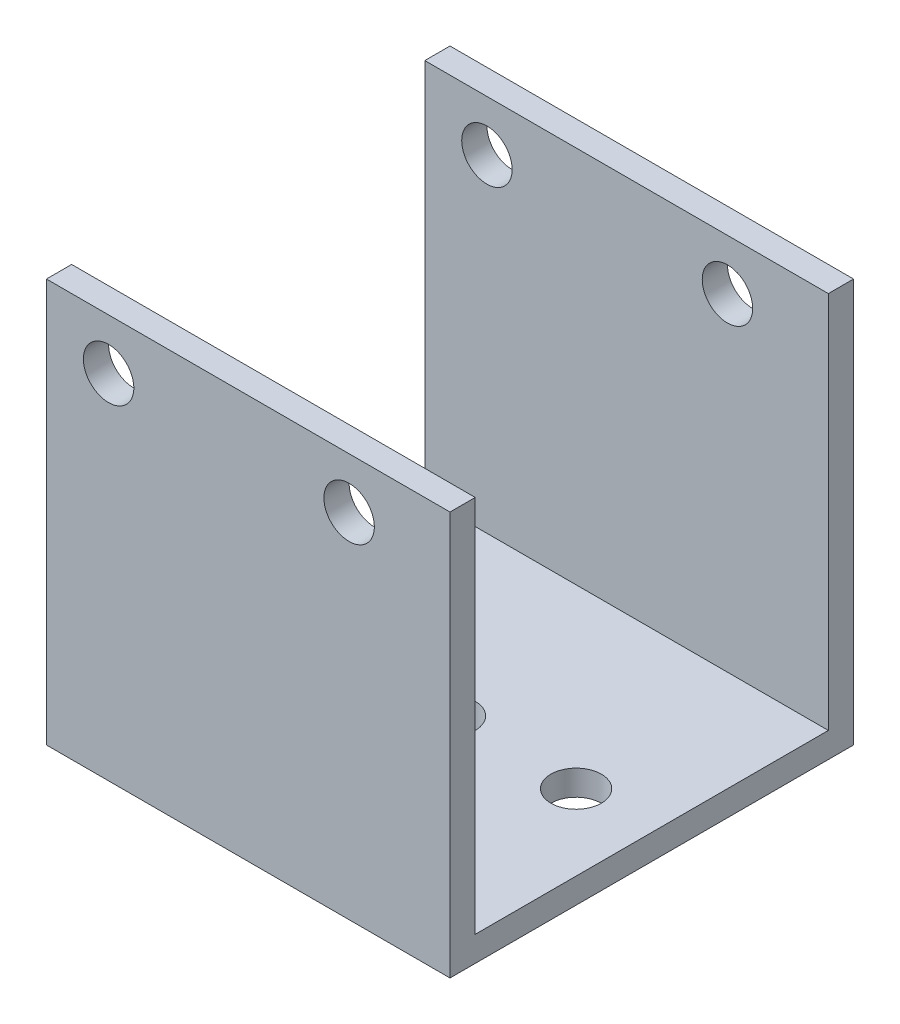
ISO-10303-21;
HEADER;
FILE_DESCRIPTION(('STEP AP214'),'2;1');
FILE_NAME('part.step','',(''),(''),'','','');
FILE_SCHEMA(('AUTOMOTIVE_DESIGN { 1 0 10303 214 1 1 1 1 }'));
ENDSEC;
DATA;
#1=APPLICATION_CONTEXT('core data for automotive mechanical design processes');
#2=APPLICATION_PROTOCOL_DEFINITION('international standard','automotive_design',2000,#1);
#3=PRODUCT_CONTEXT('',#1,'mechanical');
#4=PRODUCT('Part','Part','',(#3));
#5=PRODUCT_RELATED_PRODUCT_CATEGORY('part','',(#4));
#6=PRODUCT_DEFINITION_FORMATION('','',#4);
#7=PRODUCT_DEFINITION_CONTEXT('part definition',#1,'design');
#8=PRODUCT_DEFINITION('design','',#6,#7);
#9=PRODUCT_DEFINITION_SHAPE('','',#8);
#10=(LENGTH_UNIT() NAMED_UNIT(*) SI_UNIT(.MILLI.,.METRE.));
#11=(NAMED_UNIT(*) PLANE_ANGLE_UNIT() SI_UNIT($,.RADIAN.));
#12=(NAMED_UNIT(*) SI_UNIT($,.STERADIAN.) SOLID_ANGLE_UNIT());
#13=UNCERTAINTY_MEASURE_WITH_UNIT(LENGTH_MEASURE(1.E-05),#10,'distance_accuracy_value','');
#14=(GEOMETRIC_REPRESENTATION_CONTEXT(3) GLOBAL_UNCERTAINTY_ASSIGNED_CONTEXT((#13)) GLOBAL_UNIT_ASSIGNED_CONTEXT((#10,
#11,#12)) REPRESENTATION_CONTEXT('',''));
#15=CARTESIAN_POINT('',(0.,0.,0.));
#16=DIRECTION('',(0.,0.,1.));
#17=DIRECTION('',(1.,0.,0.));
#18=AXIS2_PLACEMENT_3D('',#15,#16,#17);
#19=CARTESIAN_POINT('',(50.8,19.0697917650766,29.2658872986316));
#20=DIRECTION('',(0.,-1.,0.));
#21=DIRECTION('',(0.,0.,-1.));
#22=AXIS2_PLACEMENT_3D('',#19,#20,#21);
#23=PLANE('',#22);
#24=DIRECTION('',(0.,0.,1.));
#25=VECTOR('',#24,1.);
#26=CARTESIAN_POINT('',(0.,19.0697917650766,29.2658872986316));
#27=LINE('',#26,#25);
#28=CARTESIAN_POINT('',(0.,19.0697917650766,26.0908872986316));
#29=VERTEX_POINT('',#28);
#30=CARTESIAN_POINT('',(0.,19.0697917650766,29.2658872986316));
#31=VERTEX_POINT('',#30);
#32=EDGE_CURVE('E131',#29,#31,#27,.T.);
#33=ORIENTED_EDGE('',*,*,#32,.T.);
#34=DIRECTION('',(-1.,0.,0.));
#35=VECTOR('',#34,1.);
#36=CARTESIAN_POINT('',(50.8,19.0697917650766,29.2658872986316));
#37=LINE('',#36,#35);
#38=CARTESIAN_POINT('',(50.8,19.0697917650766,29.2658872986316));
#39=VERTEX_POINT('',#38);
#40=EDGE_CURVE('E11',#39,#31,#37,.T.);
#41=ORIENTED_EDGE('',*,*,#40,.F.);
#42=DIRECTION('',(0.,0.,1.));
#43=VECTOR('',#42,1.);
#44=CARTESIAN_POINT('',(50.8,19.0697917650766,29.2658872986316));
#45=LINE('',#44,#43);
#46=CARTESIAN_POINT('',(50.8,19.0697917650766,26.0908872986316));
#47=VERTEX_POINT('',#46);
#48=EDGE_CURVE('E146',#47,#39,#45,.T.);
#49=ORIENTED_EDGE('',*,*,#48,.F.);
#50=DIRECTION('',(-1.,0.,0.));
#51=VECTOR('',#50,1.);
#52=CARTESIAN_POINT('',(50.8,19.0697917650766,26.0908872986316));
#53=LINE('',#52,#51);
#54=EDGE_CURVE('E127',#47,#29,#53,.T.);
#55=ORIENTED_EDGE('',*,*,#54,.T.);
#56=EDGE_LOOP('',(#33,#41,#49,#55));
#57=FACE_BOUND('',#56,.T.);
#58=ADVANCED_FACE('F33',(#57),#23,.F.);
#59=CARTESIAN_POINT('',(50.8,19.0697917650766,29.2658872986316));
#60=DIRECTION('',(0.,0.,-1.));
#61=DIRECTION('',(0.,1.,0.));
#62=AXIS2_PLACEMENT_3D('',#59,#60,#61);
#63=PLANE('',#62);
#64=CARTESIAN_POINT('',(7.82320000000001,12.6804917650766,29.2658872986315));
#65=DIRECTION('',(0.,0.,-1.));
#66=DIRECTION('',(-1.,0.,0.));
#67=AXIS2_PLACEMENT_3D('',#64,#65,#66);
#68=CIRCLE('',#67,3.175);
#69=CARTESIAN_POINT('',(4.64820000000001,12.6804917650766,29.2658872986315));
#70=VERTEX_POINT('',#69);
#71=EDGE_CURVE('E166',#70,#70,#68,.T.);
#72=ORIENTED_EDGE('',*,*,#71,.T.);
#73=EDGE_LOOP('',(#72));
#74=FACE_BOUND('',#73,.T.);
#75=CARTESIAN_POINT('',(38.1,12.6804917650766,29.2658872986315));
#76=DIRECTION('',(0.,0.,-1.));
#77=DIRECTION('',(-1.,0.,0.));
#78=AXIS2_PLACEMENT_3D('',#75,#76,#77);
#79=CIRCLE('',#78,3.175);
#80=CARTESIAN_POINT('',(34.925,12.6804917650766,29.2658872986315));
#81=VERTEX_POINT('',#80);
#82=EDGE_CURVE('E161',#81,#81,#79,.T.);
#83=ORIENTED_EDGE('',*,*,#82,.T.);
#84=EDGE_LOOP('',(#83));
#85=FACE_BOUND('',#84,.T.);
#86=DIRECTION('',(0.,-1.,0.));
#87=VECTOR('',#86,1.);
#88=CARTESIAN_POINT('',(0.,19.0697917650766,29.2658872986316));
#89=LINE('',#88,#87);
#90=CARTESIAN_POINT('',(0.,-31.7302082349234,29.2658872986315));
#91=VERTEX_POINT('',#90);
#92=EDGE_CURVE('E134',#31,#91,#89,.T.);
#93=ORIENTED_EDGE('',*,*,#92,.T.);
#94=DIRECTION('',(-1.,0.,0.));
#95=VECTOR('',#94,1.);
#96=CARTESIAN_POINT('',(50.8,-31.7302082349234,29.2658872986315));
#97=LINE('',#96,#95);
#98=CARTESIAN_POINT('',(50.8,-31.7302082349234,29.2658872986315));
#99=VERTEX_POINT('',#98);
#100=EDGE_CURVE('E42',#99,#91,#97,.T.);
#101=ORIENTED_EDGE('',*,*,#100,.F.);
#102=DIRECTION('',(0.,-1.,0.));
#103=VECTOR('',#102,1.);
#104=CARTESIAN_POINT('',(50.8,19.0697917650766,29.2658872986316));
#105=LINE('',#104,#103);
#106=EDGE_CURVE('E94',#39,#99,#105,.T.);
#107=ORIENTED_EDGE('',*,*,#106,.F.);
#108=ORIENTED_EDGE('',*,*,#40,.T.);
#109=EDGE_LOOP('',(#93,#101,#107,#108));
#110=FACE_BOUND('',#109,.T.);
#111=ADVANCED_FACE('F235',(#74,#85,#110),#63,.F.);
#112=CARTESIAN_POINT('',(50.8,-31.7302082349234,29.2658872986315));
#113=DIRECTION('',(0.,1.,0.));
#114=DIRECTION('',(0.,0.,1.));
#115=AXIS2_PLACEMENT_3D('',#112,#113,#114);
#116=PLANE('',#115);
#117=CARTESIAN_POINT('',(9.525,-31.7302082349234,3.86588729863155));
#118=DIRECTION('',(0.,-1.,0.));
#119=DIRECTION('',(0.,0.,-1.));
#120=AXIS2_PLACEMENT_3D('',#117,#118,#119);
#121=CIRCLE('',#120,3.175);
#122=CARTESIAN_POINT('',(9.525,-31.7302082349234,0.690887298631547));
#123=VERTEX_POINT('',#122);
#124=EDGE_CURVE('E183',#123,#123,#121,.T.);
#125=ORIENTED_EDGE('',*,*,#124,.F.);
#126=EDGE_LOOP('',(#125));
#127=FACE_BOUND('',#126,.T.);
#128=CARTESIAN_POINT('',(25.4,-31.7302082349234,3.86588729863155));
#129=DIRECTION('',(0.,-1.,0.));
#130=DIRECTION('',(0.,0.,-1.));
#131=AXIS2_PLACEMENT_3D('',#128,#129,#130);
#132=CIRCLE('',#131,3.175);
#133=CARTESIAN_POINT('',(25.4,-31.7302082349234,0.690887298631547));
#134=VERTEX_POINT('',#133);
#135=EDGE_CURVE('E173',#134,#134,#132,.T.);
#136=ORIENTED_EDGE('',*,*,#135,.F.);
#137=EDGE_LOOP('',(#136));
#138=FACE_BOUND('',#137,.T.);
#139=CARTESIAN_POINT('',(41.275,-31.7302082349234,3.86588729863155));
#140=DIRECTION('',(0.,-1.,0.));
#141=DIRECTION('',(0.,0.,-1.));
#142=AXIS2_PLACEMENT_3D('',#139,#140,#141);
#143=CIRCLE('',#142,3.175);
#144=CARTESIAN_POINT('',(41.275,-31.7302082349234,0.690887298631551));
#145=VERTEX_POINT('',#144);
#146=EDGE_CURVE('E170',#145,#145,#143,.T.);
#147=ORIENTED_EDGE('',*,*,#146,.F.);
#148=EDGE_LOOP('',(#147));
#149=FACE_BOUND('',#148,.T.);
#150=DIRECTION('',(0.,0.,-1.));
#151=VECTOR('',#150,1.);
#152=CARTESIAN_POINT('',(0.,-31.7302082349234,29.2658872986315));
#153=LINE('',#152,#151);
#154=CARTESIAN_POINT('',(0.,-31.7302082349234,-21.5341127013684));
#155=VERTEX_POINT('',#154);
#156=EDGE_CURVE('E137',#91,#155,#153,.T.);
#157=ORIENTED_EDGE('',*,*,#156,.T.);
#158=DIRECTION('',(-1.,0.,0.));
#159=VECTOR('',#158,1.);
#160=CARTESIAN_POINT('',(50.8,-31.7302082349234,-21.5341127013684));
#161=LINE('',#160,#159);
#162=CARTESIAN_POINT('',(50.8,-31.7302082349234,-21.5341127013684));
#163=VERTEX_POINT('',#162);
#164=EDGE_CURVE('E153',#163,#155,#161,.T.);
#165=ORIENTED_EDGE('',*,*,#164,.F.);
#166=DIRECTION('',(0.,0.,-1.));
#167=VECTOR('',#166,1.);
#168=CARTESIAN_POINT('',(50.8,-31.7302082349234,29.2658872986315));
#169=LINE('',#168,#167);
#170=EDGE_CURVE('E201',#99,#163,#169,.T.);
#171=ORIENTED_EDGE('',*,*,#170,.F.);
#172=ORIENTED_EDGE('',*,*,#100,.T.);
#173=EDGE_LOOP('',(#157,#165,#171,#172));
#174=FACE_BOUND('',#173,.T.);
#175=ADVANCED_FACE('F239',(#127,#138,#149,#174),#116,.F.);
#176=CARTESIAN_POINT('',(50.8,-31.7302082349234,-21.5341127013684));
#177=DIRECTION('',(0.,0.,1.));
#178=DIRECTION('',(1.,0.,0.));
#179=AXIS2_PLACEMENT_3D('',#176,#177,#178);
#180=PLANE('',#179);
#181=CARTESIAN_POINT('',(7.82320000000001,12.6804917650766,-21.5341127013684));
#182=DIRECTION('',(0.,0.,-1.));
#183=DIRECTION('',(-1.,0.,0.));
#184=AXIS2_PLACEMENT_3D('',#181,#182,#183);
#185=CIRCLE('',#184,3.175);
#186=CARTESIAN_POINT('',(4.64820000000001,12.6804917650766,-21.5341127013684));
#187=VERTEX_POINT('',#186);
#188=EDGE_CURVE('E169',#187,#187,#185,.T.);
#189=ORIENTED_EDGE('',*,*,#188,.F.);
#190=EDGE_LOOP('',(#189));
#191=FACE_BOUND('',#190,.T.);
#192=CARTESIAN_POINT('',(38.1,12.6804917650766,-21.5341127013684));
#193=DIRECTION('',(0.,0.,-1.));
#194=DIRECTION('',(-1.,0.,0.));
#195=AXIS2_PLACEMENT_3D('',#192,#193,#194);
#196=CIRCLE('',#195,3.175);
#197=CARTESIAN_POINT('',(34.925,12.6804917650766,-21.5341127013684));
#198=VERTEX_POINT('',#197);
#199=EDGE_CURVE('E192',#198,#198,#196,.T.);
#200=ORIENTED_EDGE('',*,*,#199,.F.);
#201=EDGE_LOOP('',(#200));
#202=FACE_BOUND('',#201,.T.);
#203=DIRECTION('',(0.,1.,0.));
#204=VECTOR('',#203,1.);
#205=CARTESIAN_POINT('',(0.,-31.7302082349234,-21.5341127013684));
#206=LINE('',#205,#204);
#207=CARTESIAN_POINT('',(0.,19.0697917650766,-21.5341127013684));
#208=VERTEX_POINT('',#207);
#209=EDGE_CURVE('E139',#155,#208,#206,.T.);
#210=ORIENTED_EDGE('',*,*,#209,.T.);
#211=DIRECTION('',(-1.,0.,0.));
#212=VECTOR('',#211,1.);
#213=CARTESIAN_POINT('',(50.8,19.0697917650766,-21.5341127013684));
#214=LINE('',#213,#212);
#215=CARTESIAN_POINT('',(50.8,19.0697917650766,-21.5341127013684));
#216=VERTEX_POINT('',#215);
#217=EDGE_CURVE('E150',#216,#208,#214,.T.);
#218=ORIENTED_EDGE('',*,*,#217,.F.);
#219=DIRECTION('',(0.,1.,0.));
#220=VECTOR('',#219,1.);
#221=CARTESIAN_POINT('',(50.8,-31.7302082349234,-21.5341127013684));
#222=LINE('',#221,#220);
#223=EDGE_CURVE('E203',#163,#216,#222,.T.);
#224=ORIENTED_EDGE('',*,*,#223,.F.);
#225=ORIENTED_EDGE('',*,*,#164,.T.);
#226=EDGE_LOOP('',(#210,#218,#224,#225));
#227=FACE_BOUND('',#226,.T.);
#228=ADVANCED_FACE('F209',(#191,#202,#227),#180,.F.);
#229=CARTESIAN_POINT('',(50.8,19.0697917650766,-18.3591127013684));
#230=DIRECTION('',(0.,-1.,0.));
#231=DIRECTION('',(0.,0.,-1.));
#232=AXIS2_PLACEMENT_3D('',#229,#230,#231);
#233=PLANE('',#232);
#234=DIRECTION('',(0.,0.,1.));
#235=VECTOR('',#234,1.);
#236=CARTESIAN_POINT('',(0.,19.0697917650766,-18.3591127013684));
#237=LINE('',#236,#235);
#238=CARTESIAN_POINT('',(0.,19.0697917650766,-18.3591127013684));
#239=VERTEX_POINT('',#238);
#240=EDGE_CURVE('E141',#208,#239,#237,.T.);
#241=ORIENTED_EDGE('',*,*,#240,.T.);
#242=DIRECTION('',(-1.,0.,0.));
#243=VECTOR('',#242,1.);
#244=CARTESIAN_POINT('',(50.8,19.0697917650766,-18.3591127013684));
#245=LINE('',#244,#243);
#246=CARTESIAN_POINT('',(50.8,19.0697917650766,-18.3591127013684));
#247=VERTEX_POINT('',#246);
#248=EDGE_CURVE('E122',#247,#239,#245,.T.);
#249=ORIENTED_EDGE('',*,*,#248,.F.);
#250=DIRECTION('',(0.,0.,1.));
#251=VECTOR('',#250,1.);
#252=CARTESIAN_POINT('',(50.8,19.0697917650766,-18.3591127013684));
#253=LINE('',#252,#251);
#254=EDGE_CURVE('E113',#216,#247,#253,.T.);
#255=ORIENTED_EDGE('',*,*,#254,.F.);
#256=ORIENTED_EDGE('',*,*,#217,.T.);
#257=EDGE_LOOP('',(#241,#249,#255,#256));
#258=FACE_BOUND('',#257,.T.);
#259=ADVANCED_FACE('F213',(#258),#233,.F.);
#260=CARTESIAN_POINT('',(50.8,-28.5552082349234,-18.3591127013684));
#261=DIRECTION('',(0.,0.,-1.));
#262=DIRECTION('',(-1.,0.,0.));
#263=AXIS2_PLACEMENT_3D('',#260,#261,#262);
#264=PLANE('',#263);
#265=CARTESIAN_POINT('',(7.82320000000001,12.6804917650766,-18.3591127013685));
#266=DIRECTION('',(0.,0.,-1.));
#267=DIRECTION('',(-1.,0.,0.));
#268=AXIS2_PLACEMENT_3D('',#265,#266,#267);
#269=CIRCLE('',#268,3.175);
#270=CARTESIAN_POINT('',(4.64820000000001,12.6804917650766,-18.3591127013685));
#271=VERTEX_POINT('',#270);
#272=EDGE_CURVE('E165',#271,#271,#269,.T.);
#273=ORIENTED_EDGE('',*,*,#272,.T.);
#274=EDGE_LOOP('',(#273));
#275=FACE_BOUND('',#274,.T.);
#276=CARTESIAN_POINT('',(38.1,12.6804917650766,-18.3591127013685));
#277=DIRECTION('',(0.,0.,-1.));
#278=DIRECTION('',(-1.,0.,0.));
#279=AXIS2_PLACEMENT_3D('',#276,#277,#278);
#280=CIRCLE('',#279,3.175);
#281=CARTESIAN_POINT('',(34.925,12.6804917650766,-18.3591127013685));
#282=VERTEX_POINT('',#281);
#283=EDGE_CURVE('E135',#282,#282,#280,.T.);
#284=ORIENTED_EDGE('',*,*,#283,.T.);
#285=EDGE_LOOP('',(#284));
#286=FACE_BOUND('',#285,.T.);
#287=DIRECTION('',(0.,-1.,0.));
#288=VECTOR('',#287,1.);
#289=CARTESIAN_POINT('',(0.,-28.5552082349234,-18.3591127013684));
#290=LINE('',#289,#288);
#291=CARTESIAN_POINT('',(0.,-28.5552082349234,-18.3591127013684));
#292=VERTEX_POINT('',#291);
#293=EDGE_CURVE('E121',#239,#292,#290,.T.);
#294=ORIENTED_EDGE('',*,*,#293,.T.);
#295=DIRECTION('',(-1.,0.,0.));
#296=VECTOR('',#295,1.);
#297=CARTESIAN_POINT('',(50.8,-28.5552082349234,-18.3591127013684));
#298=LINE('',#297,#296);
#299=CARTESIAN_POINT('',(50.8,-28.5552082349234,-18.3591127013684));
#300=VERTEX_POINT('',#299);
#301=EDGE_CURVE('E118',#300,#292,#298,.T.);
#302=ORIENTED_EDGE('',*,*,#301,.F.);
#303=DIRECTION('',(0.,-1.,0.));
#304=VECTOR('',#303,1.);
#305=CARTESIAN_POINT('',(50.8,-28.5552082349234,-18.3591127013684));
#306=LINE('',#305,#304);
#307=EDGE_CURVE('E107',#247,#300,#306,.T.);
#308=ORIENTED_EDGE('',*,*,#307,.F.);
#309=ORIENTED_EDGE('',*,*,#248,.T.);
#310=EDGE_LOOP('',(#294,#302,#308,#309));
#311=FACE_BOUND('',#310,.T.);
#312=ADVANCED_FACE('F119',(#275,#286,#311),#264,.F.);
#313=CARTESIAN_POINT('',(50.8,-28.5552082349234,26.0908872986315));
#314=DIRECTION('',(0.,-1.,0.));
#315=DIRECTION('',(0.,0.,-1.));
#316=AXIS2_PLACEMENT_3D('',#313,#314,#315);
#317=PLANE('',#316);
#318=CARTESIAN_POINT('',(9.525,-28.5552082349234,3.86588729863155));
#319=DIRECTION('',(0.,-1.,0.));
#320=DIRECTION('',(0.,0.,-1.));
#321=AXIS2_PLACEMENT_3D('',#318,#319,#320);
#322=CIRCLE('',#321,3.175);
#323=CARTESIAN_POINT('',(9.525,-28.5552082349234,0.690887298631547));
#324=VERTEX_POINT('',#323);
#325=EDGE_CURVE('E36',#324,#324,#322,.T.);
#326=ORIENTED_EDGE('',*,*,#325,.T.);
#327=EDGE_LOOP('',(#326));
#328=FACE_BOUND('',#327,.T.);
#329=CARTESIAN_POINT('',(25.4,-28.5552082349234,3.86588729863155));
#330=DIRECTION('',(0.,-1.,0.));
#331=DIRECTION('',(0.,0.,-1.));
#332=AXIS2_PLACEMENT_3D('',#329,#330,#331);
#333=CIRCLE('',#332,3.175);
#334=CARTESIAN_POINT('',(25.4,-28.5552082349234,0.690887298631547));
#335=VERTEX_POINT('',#334);
#336=EDGE_CURVE('E171',#335,#335,#333,.T.);
#337=ORIENTED_EDGE('',*,*,#336,.T.);
#338=EDGE_LOOP('',(#337));
#339=FACE_BOUND('',#338,.T.);
#340=CARTESIAN_POINT('',(41.275,-28.5552082349234,3.86588729863155));
#341=DIRECTION('',(0.,-1.,0.));
#342=DIRECTION('',(0.,0.,-1.));
#343=AXIS2_PLACEMENT_3D('',#340,#341,#342);
#344=CIRCLE('',#343,3.175);
#345=CARTESIAN_POINT('',(41.275,-28.5552082349234,0.690887298631551));
#346=VERTEX_POINT('',#345);
#347=EDGE_CURVE('E167',#346,#346,#344,.T.);
#348=ORIENTED_EDGE('',*,*,#347,.T.);
#349=EDGE_LOOP('',(#348));
#350=FACE_BOUND('',#349,.T.);
#351=DIRECTION('',(0.,0.,1.));
#352=VECTOR('',#351,1.);
#353=CARTESIAN_POINT('',(0.,-28.5552082349234,26.0908872986315));
#354=LINE('',#353,#352);
#355=CARTESIAN_POINT('',(0.,-28.5552082349234,26.0908872986315));
#356=VERTEX_POINT('',#355);
#357=EDGE_CURVE('E80',#292,#356,#354,.T.);
#358=ORIENTED_EDGE('',*,*,#357,.T.);
#359=DIRECTION('',(-1.,0.,0.));
#360=VECTOR('',#359,1.);
#361=CARTESIAN_POINT('',(50.8,-28.5552082349234,26.0908872986315));
#362=LINE('',#361,#360);
#363=CARTESIAN_POINT('',(50.8,-28.5552082349234,26.0908872986315));
#364=VERTEX_POINT('',#363);
#365=EDGE_CURVE('E123',#364,#356,#362,.T.);
#366=ORIENTED_EDGE('',*,*,#365,.F.);
#367=DIRECTION('',(0.,0.,1.));
#368=VECTOR('',#367,1.);
#369=CARTESIAN_POINT('',(50.8,-28.5552082349234,26.0908872986315));
#370=LINE('',#369,#368);
#371=EDGE_CURVE('E111',#300,#364,#370,.T.);
#372=ORIENTED_EDGE('',*,*,#371,.F.);
#373=ORIENTED_EDGE('',*,*,#301,.T.);
#374=EDGE_LOOP('',(#358,#366,#372,#373));
#375=FACE_BOUND('',#374,.T.);
#376=ADVANCED_FACE('F125',(#328,#339,#350,#375),#317,.F.);
#377=CARTESIAN_POINT('',(50.8,19.0697917650766,26.0908872986316));
#378=DIRECTION('',(0.,0.,1.));
#379=DIRECTION('',(0.,-1.,0.));
#380=AXIS2_PLACEMENT_3D('',#377,#378,#379);
#381=PLANE('',#380);
#382=CARTESIAN_POINT('',(7.82320000000001,12.6804917650766,26.0908872986316));
#383=DIRECTION('',(0.,0.,1.));
#384=DIRECTION('',(0.,-1.,0.));
#385=AXIS2_PLACEMENT_3D('',#382,#383,#384);
#386=CIRCLE('',#385,3.175);
#387=CARTESIAN_POINT('',(7.82320000000001,9.50549176507661,26.0908872986316));
#388=VERTEX_POINT('',#387);
#389=EDGE_CURVE('E162',#388,#388,#386,.T.);
#390=ORIENTED_EDGE('',*,*,#389,.T.);
#391=EDGE_LOOP('',(#390));
#392=FACE_BOUND('',#391,.T.);
#393=CARTESIAN_POINT('',(38.1,12.6804917650766,26.0908872986316));
#394=DIRECTION('',(0.,0.,1.));
#395=DIRECTION('',(0.,-1.,0.));
#396=AXIS2_PLACEMENT_3D('',#393,#394,#395);
#397=CIRCLE('',#396,3.175);
#398=CARTESIAN_POINT('',(38.1,9.50549176507663,26.0908872986316));
#399=VERTEX_POINT('',#398);
#400=EDGE_CURVE('E158',#399,#399,#397,.T.);
#401=ORIENTED_EDGE('',*,*,#400,.T.);
#402=EDGE_LOOP('',(#401));
#403=FACE_BOUND('',#402,.T.);
#404=DIRECTION('',(0.,1.,0.));
#405=VECTOR('',#404,1.);
#406=CARTESIAN_POINT('',(0.,19.0697917650766,26.0908872986316));
#407=LINE('',#406,#405);
#408=EDGE_CURVE('E86',#356,#29,#407,.T.);
#409=ORIENTED_EDGE('',*,*,#408,.T.);
#410=ORIENTED_EDGE('',*,*,#54,.F.);
#411=DIRECTION('',(0.,1.,0.));
#412=VECTOR('',#411,1.);
#413=CARTESIAN_POINT('',(50.8,19.0697917650766,26.0908872986316));
#414=LINE('',#413,#412);
#415=EDGE_CURVE('E51',#364,#47,#414,.T.);
#416=ORIENTED_EDGE('',*,*,#415,.F.);
#417=ORIENTED_EDGE('',*,*,#365,.T.);
#418=EDGE_LOOP('',(#409,#410,#416,#417));
#419=FACE_BOUND('',#418,.T.);
#420=ADVANCED_FACE('F221',(#392,#403,#419),#381,.F.);
#421=CARTESIAN_POINT('',(50.8,0.,0.));
#422=DIRECTION('',(-1.,0.,0.));
#423=DIRECTION('',(0.,0.,1.));
#424=AXIS2_PLACEMENT_3D('',#421,#422,#423);
#425=PLANE('',#424);
#426=ORIENTED_EDGE('',*,*,#48,.T.);
#427=ORIENTED_EDGE('',*,*,#106,.T.);
#428=ORIENTED_EDGE('',*,*,#170,.T.);
#429=ORIENTED_EDGE('',*,*,#223,.T.);
#430=ORIENTED_EDGE('',*,*,#254,.T.);
#431=ORIENTED_EDGE('',*,*,#307,.T.);
#432=ORIENTED_EDGE('',*,*,#371,.T.);
#433=ORIENTED_EDGE('',*,*,#415,.T.);
#434=EDGE_LOOP('',(#426,#427,#428,#429,#430,#431,#432,#433));
#435=FACE_BOUND('',#434,.T.);
#436=ADVANCED_FACE('F109',(#435),#425,.F.);
#437=CARTESIAN_POINT('',(0.,0.,0.));
#438=DIRECTION('',(-1.,0.,0.));
#439=DIRECTION('',(0.,0.,1.));
#440=AXIS2_PLACEMENT_3D('',#437,#438,#439);
#441=PLANE('',#440);
#442=ORIENTED_EDGE('',*,*,#32,.F.);
#443=ORIENTED_EDGE('',*,*,#408,.F.);
#444=ORIENTED_EDGE('',*,*,#357,.F.);
#445=ORIENTED_EDGE('',*,*,#293,.F.);
#446=ORIENTED_EDGE('',*,*,#240,.F.);
#447=ORIENTED_EDGE('',*,*,#209,.F.);
#448=ORIENTED_EDGE('',*,*,#156,.F.);
#449=ORIENTED_EDGE('',*,*,#92,.F.);
#450=EDGE_LOOP('',(#442,#443,#444,#445,#446,#447,#448,#449));
#451=FACE_BOUND('',#450,.T.);
#452=ADVANCED_FACE('F216',(#451),#441,.T.);
#453=CARTESIAN_POINT('',(38.1,12.6804917650766,29.2658872986315));
#454=DIRECTION('',(0.,0.,-1.));
#455=DIRECTION('',(-1.,0.,0.));
#456=AXIS2_PLACEMENT_3D('',#453,#454,#455);
#457=CYLINDRICAL_SURFACE('',#456,3.175);
#458=ORIENTED_EDGE('',*,*,#82,.F.);
#459=EDGE_LOOP('',(#458));
#460=FACE_BOUND('',#459,.T.);
#461=ORIENTED_EDGE('',*,*,#400,.F.);
#462=EDGE_LOOP('',(#461));
#463=FACE_BOUND('',#462,.T.);
#464=ADVANCED_FACE('F264',(#460,#463),#457,.F.);
#465=ORIENTED_EDGE('',*,*,#199,.T.);
#466=EDGE_LOOP('',(#465));
#467=FACE_BOUND('',#466,.T.);
#468=ORIENTED_EDGE('',*,*,#283,.F.);
#469=EDGE_LOOP('',(#468));
#470=FACE_BOUND('',#469,.T.);
#471=ADVANCED_FACE('F261',(#467,#470),#457,.F.);
#472=CARTESIAN_POINT('',(7.82320000000001,12.6804917650766,29.2658872986315));
#473=DIRECTION('',(0.,0.,-1.));
#474=DIRECTION('',(-1.,0.,0.));
#475=AXIS2_PLACEMENT_3D('',#472,#473,#474);
#476=CYLINDRICAL_SURFACE('',#475,3.175);
#477=ORIENTED_EDGE('',*,*,#71,.F.);
#478=EDGE_LOOP('',(#477));
#479=FACE_BOUND('',#478,.T.);
#480=ORIENTED_EDGE('',*,*,#389,.F.);
#481=EDGE_LOOP('',(#480));
#482=FACE_BOUND('',#481,.T.);
#483=ADVANCED_FACE('F263',(#479,#482),#476,.F.);
#484=ORIENTED_EDGE('',*,*,#188,.T.);
#485=EDGE_LOOP('',(#484));
#486=FACE_BOUND('',#485,.T.);
#487=ORIENTED_EDGE('',*,*,#272,.F.);
#488=EDGE_LOOP('',(#487));
#489=FACE_BOUND('',#488,.T.);
#490=ADVANCED_FACE('F271',(#486,#489),#476,.F.);
#491=CARTESIAN_POINT('',(41.275,19.0697917650766,3.86588729863155));
#492=DIRECTION('',(0.,-1.,0.));
#493=DIRECTION('',(0.,0.,-1.));
#494=AXIS2_PLACEMENT_3D('',#491,#492,#493);
#495=CYLINDRICAL_SURFACE('',#494,3.175);
#496=ORIENTED_EDGE('',*,*,#146,.T.);
#497=EDGE_LOOP('',(#496));
#498=FACE_BOUND('',#497,.T.);
#499=ORIENTED_EDGE('',*,*,#347,.F.);
#500=EDGE_LOOP('',(#499));
#501=FACE_BOUND('',#500,.T.);
#502=ADVANCED_FACE('F306',(#498,#501),#495,.F.);
#503=CARTESIAN_POINT('',(25.4,19.0697917650766,3.86588729863155));
#504=DIRECTION('',(0.,-1.,0.));
#505=DIRECTION('',(0.,0.,-1.));
#506=AXIS2_PLACEMENT_3D('',#503,#504,#505);
#507=CYLINDRICAL_SURFACE('',#506,3.175);
#508=ORIENTED_EDGE('',*,*,#135,.T.);
#509=EDGE_LOOP('',(#508));
#510=FACE_BOUND('',#509,.T.);
#511=ORIENTED_EDGE('',*,*,#336,.F.);
#512=EDGE_LOOP('',(#511));
#513=FACE_BOUND('',#512,.T.);
#514=ADVANCED_FACE('F330',(#510,#513),#507,.F.);
#515=CARTESIAN_POINT('',(9.525,19.0697917650766,3.86588729863155));
#516=DIRECTION('',(0.,-1.,0.));
#517=DIRECTION('',(0.,0.,-1.));
#518=AXIS2_PLACEMENT_3D('',#515,#516,#517);
#519=CYLINDRICAL_SURFACE('',#518,3.175);
#520=ORIENTED_EDGE('',*,*,#124,.T.);
#521=EDGE_LOOP('',(#520));
#522=FACE_BOUND('',#521,.T.);
#523=ORIENTED_EDGE('',*,*,#325,.F.);
#524=EDGE_LOOP('',(#523));
#525=FACE_BOUND('',#524,.T.);
#526=ADVANCED_FACE('F339',(#522,#525),#519,.F.);
#527=CLOSED_SHELL('',(#58,#111,#175,#228,#259,#312,#376,#420,#436,#452,#464,#471,#483,#490,#502,
#514,#526));
#528=MANIFOLD_SOLID_BREP('B2',#527);
#529=ADVANCED_BREP_SHAPE_REPRESENTATION('',(#18,#528),#14);
#530=SHAPE_DEFINITION_REPRESENTATION(#9,#529);
ENDSEC;
END-ISO-10303-21;
